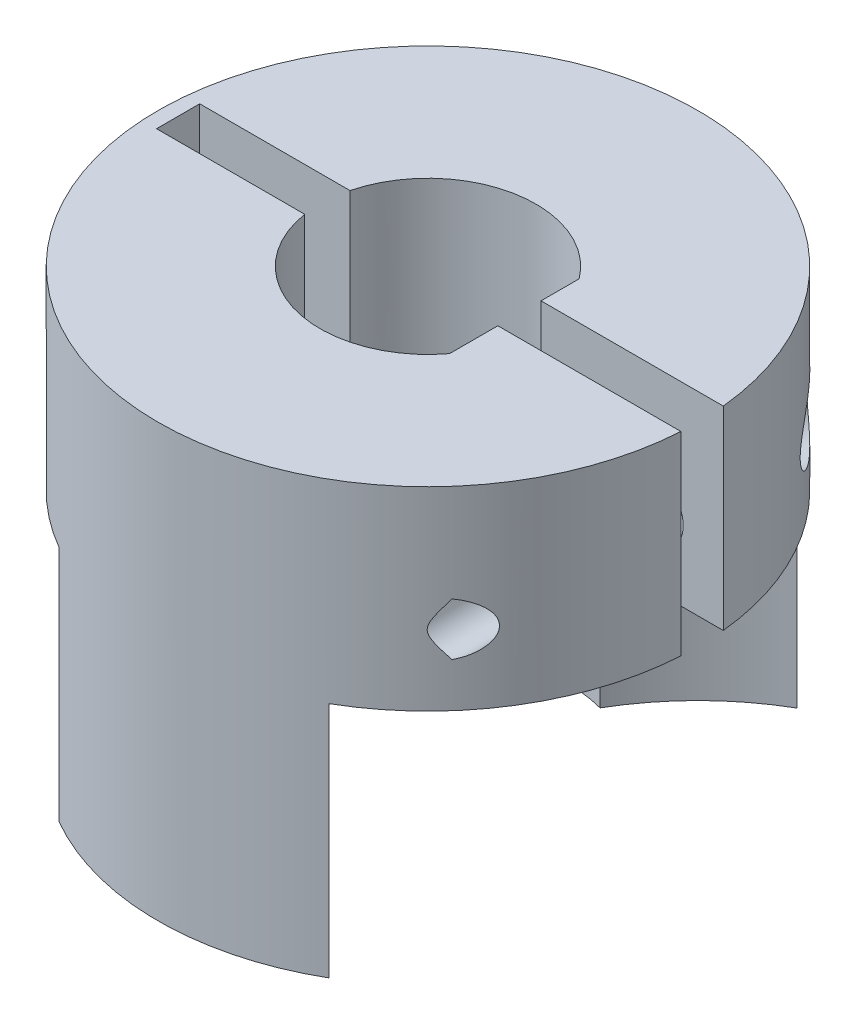
ISO-10303-21;
HEADER;
FILE_DESCRIPTION(('STEP AP214'),'2;1');
FILE_NAME('part.step','',(''),(''),'','','');
FILE_SCHEMA(('AUTOMOTIVE_DESIGN { 1 0 10303 214 1 1 1 1 }'));
ENDSEC;
DATA;
#1=APPLICATION_CONTEXT('core data for automotive mechanical design processes');
#2=APPLICATION_PROTOCOL_DEFINITION('international standard','automotive_design',2000,#1);
#3=PRODUCT_CONTEXT('',#1,'mechanical');
#4=PRODUCT('Part','Part','',(#3));
#5=PRODUCT_RELATED_PRODUCT_CATEGORY('part','',(#4));
#6=PRODUCT_DEFINITION_FORMATION('','',#4);
#7=PRODUCT_DEFINITION_CONTEXT('part definition',#1,'design');
#8=PRODUCT_DEFINITION('design','',#6,#7);
#9=PRODUCT_DEFINITION_SHAPE('','',#8);
#10=(LENGTH_UNIT() NAMED_UNIT(*) SI_UNIT(.MILLI.,.METRE.));
#11=(NAMED_UNIT(*) PLANE_ANGLE_UNIT() SI_UNIT($,.RADIAN.));
#12=(NAMED_UNIT(*) SI_UNIT($,.STERADIAN.) SOLID_ANGLE_UNIT());
#13=UNCERTAINTY_MEASURE_WITH_UNIT(LENGTH_MEASURE(1.E-05),#10,'distance_accuracy_value','');
#14=(GEOMETRIC_REPRESENTATION_CONTEXT(3) GLOBAL_UNCERTAINTY_ASSIGNED_CONTEXT((#13)) GLOBAL_UNIT_ASSIGNED_CONTEXT((#10,
#11,#12)) REPRESENTATION_CONTEXT('',''));
#15=CARTESIAN_POINT('',(0.,0.,0.));
#16=DIRECTION('',(0.,0.,1.));
#17=DIRECTION('',(1.,0.,0.));
#18=AXIS2_PLACEMENT_3D('',#15,#16,#17);
#19=CARTESIAN_POINT('',(9.0873866256993,3.27091239165496,8.26580270830846));
#20=DIRECTION('',(0.,0.,-1.));
#21=DIRECTION('',(-1.,0.,0.));
#22=AXIS2_PLACEMENT_3D('',#19,#20,#21);
#23=CONICAL_SURFACE('',#22,1.25000000001818,1.02974425869486);
#24=CARTESIAN_POINT('',(9.37691343605857,2.05490489736888,8.26580270827864));
#25=CARTESIAN_POINT('',(9.34823636964544,2.10377913839185,8.29833765727385));
#26=CARTESIAN_POINT('',(9.31937379006483,2.15263708601481,8.33073567660937));
#27=CARTESIAN_POINT('',(9.26145900650451,2.25060359496529,8.3950723029447));
#28=CARTESIAN_POINT('',(9.23240668328306,2.29971230857222,8.42701057028863));
#29=CARTESIAN_POINT('',(9.17398462157774,2.39899043619154,8.49057671104065));
#30=CARTESIAN_POINT('',(9.14461528034057,2.44916549976722,8.52219619644441));
#31=CARTESIAN_POINT('',(9.08634435046157,2.55045645984429,8.58429704274558));
#32=CARTESIAN_POINT('',(9.05744259648956,2.60157200951201,8.61477881113187));
#33=CARTESIAN_POINT('',(9.00354761064104,2.70073710212104,8.67107231345171));
#34=CARTESIAN_POINT('',(8.9784419807633,2.74862479685397,8.69705395236432));
#35=CARTESIAN_POINT('',(8.94256452914462,2.82239890995484,8.7338901458976));
#36=CARTESIAN_POINT('',(8.93090353018432,2.84731087232748,8.74581150341275));
#37=CARTESIAN_POINT('',(8.90848505946333,2.89798263721264,8.76864580340958));
#38=CARTESIAN_POINT('',(8.89772721596009,2.92374208475953,8.77955916097537));
#39=CARTESIAN_POINT('',(8.87477187867222,2.98351899911913,8.8027697516426));
#40=CARTESIAN_POINT('',(8.86298277476017,3.01787154664654,8.81463178938376));
#41=CARTESIAN_POINT('',(8.84297662071251,3.0885904327126,8.83470252808923));
#42=CARTESIAN_POINT('',(8.83474366884786,3.12494696915738,8.8429274966196));
#43=CARTESIAN_POINT('',(8.82646544984643,3.17997429994769,8.85118760745881));
#44=CARTESIAN_POINT('',(8.82438832670974,3.19803567567978,8.85325786514942));
#45=CARTESIAN_POINT('',(8.82159655147002,3.23436609213067,8.8560396277983));
#46=CARTESIAN_POINT('',(8.82088162370194,3.25263509008038,8.85675140766933));
#47=CARTESIAN_POINT('',(8.82089059499563,3.30119070653191,8.85674275516931));
#48=CARTESIAN_POINT('',(8.82286746779234,3.33149180944732,8.85477504941482));
#49=CARTESIAN_POINT('',(8.83036615861769,3.39121750209244,8.84729665177245));
#50=CARTESIAN_POINT('',(8.83589671842577,3.42063974260183,8.841777222887));
#51=CARTESIAN_POINT('',(8.84997684207437,3.47974627246575,8.8276844707538));
#52=CARTESIAN_POINT('',(8.85867557033292,3.50935615822802,8.81896003270859));
#53=CARTESIAN_POINT('',(8.87806287003813,3.56723388829251,8.79944254836492));
#54=CARTESIAN_POINT('',(8.88875511147401,3.59549913471964,8.78864568570435));
#55=CARTESIAN_POINT('',(8.91158572947415,3.65127080230195,8.7654953073146));
#56=CARTESIAN_POINT('',(8.92374162950388,3.67876189455889,8.75312279991039));
#57=CARTESIAN_POINT('',(8.94890827634455,3.73283433069144,8.72739164745311));
#58=CARTESIAN_POINT('',(8.96191833341778,3.75941638287051,8.71403379702007));
#59=CARTESIAN_POINT('',(8.99137826196812,3.81760440217316,8.68364300764587));
#60=CARTESIAN_POINT('',(9.00796311503814,3.8490523004461,8.66644045492225));
#61=CARTESIAN_POINT('',(9.04162787703195,3.91127509182417,8.63131272356054));
#62=CARTESIAN_POINT('',(9.05870787571594,3.94204986110761,8.61338741366761));
#63=CARTESIAN_POINT('',(9.11038941308483,4.03374716493374,8.55881467340505));
#64=CARTESIAN_POINT('',(9.14540001417478,4.09398140351941,8.52140386924328));
#65=CARTESIAN_POINT('',(9.21333518724035,4.20983556081705,8.44788756437903));
#66=CARTESIAN_POINT('',(9.24625068273812,4.2655051359255,8.41185056329275));
#67=CARTESIAN_POINT('',(9.31183061237871,4.37641137251642,8.33919771970762));
#68=CARTESIAN_POINT('',(9.34449542356095,4.43164868873858,8.30258321961203));
#69=CARTESIAN_POINT('',(9.37691343606799,4.48691988594578,8.26580270829685));
#70=B_SPLINE_CURVE_WITH_KNOTS('',3,(#24,#25,#26,#27,#28,#29,#30,#31,#32,#33,#34,#35,#36,#37,#38,
#39,#40,#41,#42,#43,#44,#45,#46,#47,#48,#49,#50,#51,#52,#53,#54,#55,#56,#57,#58,#59,#60,#61,#62,
#63,#64,#65,#66,#67,#68,#69),.UNSPECIFIED.,.F.,.F.,(4,2,2,2,2,2,2,2,2,2,2,2,2,2,2,2,2,2,2,2,2,2,
4),(0.,0.19602753707263,0.392193144534779,0.59072440701087,0.78918386679318,0.969036882124861,
1.05894136689586,1.14880866330088,1.26320249647365,1.37707937178137,1.43188093236441,
1.48667140167539,1.5774377040964,1.66842814345155,1.764417363518,1.8605850732717,
1.95804683652526,2.05543084435016,2.1738952739997,2.29238131489985,2.52958422441266,
2.75168786867404,2.97333487639234),.UNSPECIFIED.);
#71=CARTESIAN_POINT('',(9.37691343608817,2.05490489738761,8.26580270827397));
#72=VERTEX_POINT('',#71);
#73=CARTESIAN_POINT('',(9.37691343608786,4.48691988592178,8.26580270827431));
#74=VERTEX_POINT('',#73);
#75=EDGE_CURVE('E21',#72,#74,#70,.T.);
#76=ORIENTED_EDGE('',*,*,#75,.F.);
#77=CARTESIAN_POINT('',(9.0873866256993,3.27091239165496,8.26580270825177));
#78=DIRECTION('',(0.,0.,-1.));
#79=DIRECTION('',(-1.,0.,0.));
#80=AXIS2_PLACEMENT_3D('',#77,#78,#79);
#81=CIRCLE('',#80,1.25);
#82=EDGE_CURVE('E142',#72,#74,#81,.T.);
#83=ORIENTED_EDGE('',*,*,#82,.T.);
#84=EDGE_LOOP('',(#76,#83));
#85=FACE_BOUND('',#84,.T.);
#86=ADVANCED_FACE('F17',(#85),#23,.F.);
#87=CARTESIAN_POINT('',(0.,0.999999999999999,0.));
#88=DIRECTION('',(0.,1.,0.));
#89=DIRECTION('',(0.,0.,1.));
#90=AXIS2_PLACEMENT_3D('',#87,#88,#89);
#91=PLANE('',#90);
#92=DIRECTION('',(1.,0.,0.));
#93=VECTOR('',#92,1.);
#94=CARTESIAN_POINT('',(-11.8043105196322,0.999999999999999,0.765802708251773));
#95=LINE('',#94,#93);
#96=CARTESIAN_POINT('',(-11.8043105196322,0.999999999999999,0.765802708251773));
#97=VERTEX_POINT('',#96);
#98=CARTESIAN_POINT('',(-4.94100659906807,0.999999999999999,0.765802708251773));
#99=VERTEX_POINT('',#98);
#100=EDGE_CURVE('E144',#97,#99,#95,.T.);
#101=ORIENTED_EDGE('',*,*,#100,.T.);
#102=CARTESIAN_POINT('',(0.,0.999999999999999,0.));
#103=DIRECTION('',(0.,-1.,0.));
#104=DIRECTION('',(0.,0.,-1.));
#105=AXIS2_PLACEMENT_3D('',#102,#103,#104);
#106=CIRCLE('',#105,5.);
#107=CARTESIAN_POINT('',(-4.84528193658959,0.999999999999999,-1.23419729174823));
#108=VERTEX_POINT('',#107);
#109=EDGE_CURVE('E337',#99,#108,#106,.T.);
#110=ORIENTED_EDGE('',*,*,#109,.T.);
#111=DIRECTION('',(-1.,0.,0.));
#112=VECTOR('',#111,1.);
#113=CARTESIAN_POINT('',(-3.32475969081981,0.999999999999999,-1.23419729174823));
#114=LINE('',#113,#112);
#115=CARTESIAN_POINT('',(-11.8043105196322,0.999999999999999,-1.23419729174823));
#116=VERTEX_POINT('',#115);
#117=EDGE_CURVE('E229',#108,#116,#114,.T.);
#118=ORIENTED_EDGE('',*,*,#117,.T.);
#119=DIRECTION('',(0.,0.,1.));
#120=VECTOR('',#119,1.);
#121=CARTESIAN_POINT('',(-11.8043105196322,0.999999999999999,-1.23419729174823));
#122=LINE('',#121,#120);
#123=EDGE_CURVE('E221',#116,#97,#122,.T.);
#124=ORIENTED_EDGE('',*,*,#123,.T.);
#125=EDGE_LOOP('',(#101,#110,#118,#124));
#126=FACE_BOUND('',#125,.T.);
#127=ADVANCED_FACE('F208',(#126),#91,.T.);
#128=CARTESIAN_POINT('',(9.0873866256993,3.27091239165496,0.765802708251773));
#129=DIRECTION('',(0.,0.,-1.));
#130=DIRECTION('',(-1.,0.,0.));
#131=AXIS2_PLACEMENT_3D('',#128,#129,#130);
#132=CYLINDRICAL_SURFACE('',#131,1.25);
#133=CARTESIAN_POINT('',(9.0873866256993,3.27091239165496,0.765802708251773));
#134=DIRECTION('',(0.,0.,-1.));
#135=DIRECTION('',(-1.,0.,0.));
#136=AXIS2_PLACEMENT_3D('',#133,#134,#135);
#137=CIRCLE('',#136,1.25);
#138=CARTESIAN_POINT('',(7.8373866256993,3.27091239165496,0.765802708251773));
#139=VERTEX_POINT('',#138);
#140=EDGE_CURVE('E329',#139,#139,#137,.T.);
#141=ORIENTED_EDGE('',*,*,#140,.T.);
#142=EDGE_LOOP('',(#141));
#143=FACE_BOUND('',#142,.T.);
#144=CARTESIAN_POINT('',(9.37691343610224,4.48691988589909,8.265802708258));
#145=CARTESIAN_POINT('',(9.42635211766137,4.47512071704447,8.20972797600935));
#146=CARTESIAN_POINT('',(9.47497923156122,4.46038262060935,8.1535407076429));
#147=CARTESIAN_POINT('',(9.57042977419815,4.42494242517149,8.04128549213383));
#148=CARTESIAN_POINT('',(9.61724884594837,4.40422682872897,7.98521810760817));
#149=CARTESIAN_POINT('',(9.70919960881088,4.35652663614726,7.87316740356659));
#150=CARTESIAN_POINT('',(9.7543057733657,4.32947283321155,7.81719243087551));
#151=CARTESIAN_POINT('',(9.84183287731895,4.26898035623884,7.70670366523164));
#152=CARTESIAN_POINT('',(9.88425681548962,4.23554898671687,7.65218828122307));
#153=CARTESIAN_POINT('',(9.9670636216485,4.16078164336086,7.54403098772386));
#154=CARTESIAN_POINT('',(10.0073602963814,4.11925639531322,7.49045254240309));
#155=CARTESIAN_POINT('',(10.083684943877,4.02815291750281,7.38738000353898));
#156=CARTESIAN_POINT('',(10.1197235480285,3.97859550959755,7.33787583557525));
#157=CARTESIAN_POINT('',(10.1784621073682,3.88282606204299,7.25608955181111));
#158=CARTESIAN_POINT('',(10.2023205996824,3.83848351710648,7.22247011074012));
#159=CARTESIAN_POINT('',(10.2455821366241,3.74395761270726,7.16096736805215));
#160=CARTESIAN_POINT('',(10.2649922832987,3.69378375907839,7.13307493045183));
#161=CARTESIAN_POINT('',(10.2932897849698,3.60244101476354,7.09215256357241));
#162=CARTESIAN_POINT('',(10.3036028579756,3.56260733902115,7.07714527479881));
#163=CARTESIAN_POINT('',(10.3203901095135,3.48053854465573,7.05264290959657));
#164=CARTESIAN_POINT('',(10.3268741502231,3.43830990514017,7.04313367354294));
#165=CARTESIAN_POINT('',(10.333227157052,3.37488587308372,7.03380609880895));
#166=CARTESIAN_POINT('',(10.3347825481541,3.35419382855318,7.03151999048695));
#167=CARTESIAN_POINT('',(10.3368631741153,3.31264241161596,7.02846091769711));
#168=CARTESIAN_POINT('',(10.3373881959266,3.29178300549926,7.0276882661644));
#169=CARTESIAN_POINT('',(10.3373834612683,3.22885248262355,7.02769585710759));
#170=CARTESIAN_POINT('',(10.3352416429691,3.18674705552835,7.03084913282139));
#171=CARTESIAN_POINT('',(10.3268727273246,3.10381253987385,7.04313501285828));
#172=CARTESIAN_POINT('',(10.320637743538,3.06298607495619,7.05227915992845));
#173=CARTESIAN_POINT('',(10.3027386674938,2.97442886047198,7.07840924045334));
#174=CARTESIAN_POINT('',(10.2901537464402,2.92727899631073,7.09671784790626));
#175=CARTESIAN_POINT('',(10.2606964174355,2.83720510109077,7.13924216690707));
#176=CARTESIAN_POINT('',(10.2438168989196,2.79428824376109,7.16346767237377));
#177=CARTESIAN_POINT('',(10.1972048894908,2.69176515500364,7.22975599655687));
#178=CARTESIAN_POINT('',(10.1653291973777,2.63494171793569,7.27458106309522));
#179=CARTESIAN_POINT('',(10.0962539806625,2.53021157642081,7.37015339172015));
#180=CARTESIAN_POINT('',(10.0590401505951,2.48232965422342,7.42091649721168));
#181=CARTESIAN_POINT('',(9.98818383602695,2.40297464708103,7.51591604457926));
#182=CARTESIAN_POINT('',(9.95523140298635,2.37011690945146,7.55952955719941));
#183=CARTESIAN_POINT('',(9.88714518603896,2.30915610007333,7.6483661327337));
#184=CARTESIAN_POINT('',(9.8520099738852,2.28105618724709,7.6935902410651));
#185=CARTESIAN_POINT('',(9.74380555650733,2.20343499031652,7.83082057760833));
#186=CARTESIAN_POINT('',(9.66789616186177,2.16054769618412,7.92444073776088));
#187=CARTESIAN_POINT('',(9.55475796989306,2.11096847021031,8.05974659889356));
#188=CARTESIAN_POINT('',(9.51979073508178,2.09748676243211,8.10102206760082));
#189=CARTESIAN_POINT('',(9.44900316802141,2.07378297086981,8.18347540666459));
#190=CARTESIAN_POINT('',(9.4131868374943,2.0635479813073,8.22465300085292));
#191=CARTESIAN_POINT('',(9.3769134361023,2.05490489741057,8.26580270825795));
#192=B_SPLINE_CURVE_WITH_KNOTS('',3,(#144,#145,#146,#147,#148,#149,#150,#151,#152,#153,#154,
#155,#156,#157,#158,#159,#160,#161,#162,#163,#164,#165,#166,#167,#168,#169,#170,#171,#172,#173,
#174,#175,#176,#177,#178,#179,#180,#181,#182,#183,#184,#185,#186,#187,#188,#189,#190,#191),
.UNSPECIFIED.,.F.,.F.,(4,2,2,2,2,2,2,2,2,2,2,2,2,2,2,2,2,2,2,2,2,2,2,4),(0.,0.227001607773341,
0.454519860268775,0.684648796905926,0.914515722016699,1.15059739845029,1.38607658854649,
1.56718608661381,1.74800438636254,1.87893095048438,2.0095188083324,2.07207559165955,
2.13464530839128,2.26074014266351,2.38707864401641,2.54257209338251,2.69832468792664,
2.93426268186902,3.17084519744942,3.36191791656559,3.55311700371936,3.93526999589727,
4.10245218293676,4.26896123863168),.UNSPECIFIED.);
#193=EDGE_CURVE('E141',#74,#72,#192,.T.);
#194=ORIENTED_EDGE('',*,*,#193,.F.);
#195=ORIENTED_EDGE('',*,*,#82,.F.);
#196=EDGE_LOOP('',(#194,#195));
#197=FACE_BOUND('',#196,.T.);
#198=ADVANCED_FACE('F146',(#143,#197),#132,.F.);
#199=CARTESIAN_POINT('',(-11.8043105196322,0.999999999999999,0.765802708251773));
#200=DIRECTION('',(0.,0.,1.));
#201=DIRECTION('',(1.,0.,0.));
#202=AXIS2_PLACEMENT_3D('',#199,#200,#201);
#203=PLANE('',#202);
#204=ORIENTED_EDGE('',*,*,#100,.F.);
#205=DIRECTION('',(0.,1.,0.));
#206=VECTOR('',#205,1.);
#207=CARTESIAN_POINT('',(-11.8043105196322,0.999999999999999,0.765802708251773));
#208=LINE('',#207,#206);
#209=CARTESIAN_POINT('',(-11.8043105196322,9.,0.765802708251773));
#210=VERTEX_POINT('',#209);
#211=EDGE_CURVE('E214',#97,#210,#208,.T.);
#212=ORIENTED_EDGE('',*,*,#211,.T.);
#213=DIRECTION('',(1.,0.,0.));
#214=VECTOR('',#213,1.);
#215=CARTESIAN_POINT('',(0.,9.,0.765802708251773));
#216=LINE('',#215,#214);
#217=CARTESIAN_POINT('',(-4.94100659906807,9.,0.765802708251773));
#218=VERTEX_POINT('',#217);
#219=EDGE_CURVE('E334',#218,#210,#216,.F.);
#220=ORIENTED_EDGE('',*,*,#219,.F.);
#221=DIRECTION('',(0.,-1.,0.));
#222=VECTOR('',#221,1.);
#223=CARTESIAN_POINT('',(-4.94100659906807,9.,0.765802708251773));
#224=LINE('',#223,#222);
#225=EDGE_CURVE('E217',#218,#99,#224,.T.);
#226=ORIENTED_EDGE('',*,*,#225,.T.);
#227=EDGE_LOOP('',(#204,#212,#220,#226));
#228=FACE_BOUND('',#227,.T.);
#229=ADVANCED_FACE('F200',(#228),#203,.F.);
#230=CARTESIAN_POINT('',(-11.8043105196322,0.999999999999999,-1.23419729174823));
#231=DIRECTION('',(-1.,0.,0.));
#232=DIRECTION('',(0.,0.,1.));
#233=AXIS2_PLACEMENT_3D('',#230,#231,#232);
#234=PLANE('',#233);
#235=ORIENTED_EDGE('',*,*,#211,.F.);
#236=ORIENTED_EDGE('',*,*,#123,.F.);
#237=DIRECTION('',(0.,1.,0.));
#238=VECTOR('',#237,1.);
#239=CARTESIAN_POINT('',(-11.8043105196322,0.999999999999999,-1.23419729174823));
#240=LINE('',#239,#238);
#241=CARTESIAN_POINT('',(-11.8043105196322,9.,-1.23419729174823));
#242=VERTEX_POINT('',#241);
#243=EDGE_CURVE('E232',#116,#242,#240,.T.);
#244=ORIENTED_EDGE('',*,*,#243,.T.);
#245=DIRECTION('',(0.,0.,1.));
#246=VECTOR('',#245,1.);
#247=CARTESIAN_POINT('',(-11.8043105196322,9.,0.));
#248=LINE('',#247,#246);
#249=EDGE_CURVE('E227',#210,#242,#248,.F.);
#250=ORIENTED_EDGE('',*,*,#249,.F.);
#251=EDGE_LOOP('',(#235,#236,#244,#250));
#252=FACE_BOUND('',#251,.T.);
#253=ADVANCED_FACE('F197',(#252),#234,.F.);
#254=CARTESIAN_POINT('',(-3.32475969081981,0.999999999999999,-1.23419729174823));
#255=DIRECTION('',(0.,0.,-1.));
#256=DIRECTION('',(-1.,0.,0.));
#257=AXIS2_PLACEMENT_3D('',#254,#255,#256);
#258=PLANE('',#257);
#259=DIRECTION('',(1.,0.,0.));
#260=VECTOR('',#259,1.);
#261=CARTESIAN_POINT('',(0.,9.,-1.23419729174823));
#262=LINE('',#261,#260);
#263=CARTESIAN_POINT('',(-4.84528193658959,9.,-1.23419729174823));
#264=VERTEX_POINT('',#263);
#265=EDGE_CURVE('E342',#242,#264,#262,.T.);
#266=ORIENTED_EDGE('',*,*,#265,.F.);
#267=ORIENTED_EDGE('',*,*,#243,.F.);
#268=ORIENTED_EDGE('',*,*,#117,.F.);
#269=DIRECTION('',(0.,-1.,0.));
#270=VECTOR('',#269,1.);
#271=CARTESIAN_POINT('',(-4.84528193658959,9.,-1.23419729174823));
#272=LINE('',#271,#270);
#273=EDGE_CURVE('E322',#108,#264,#272,.F.);
#274=ORIENTED_EDGE('',*,*,#273,.T.);
#275=EDGE_LOOP('',(#266,#267,#268,#274));
#276=FACE_BOUND('',#275,.T.);
#277=ADVANCED_FACE('F192',(#276),#258,.F.);
#278=CARTESIAN_POINT('',(9.08341624904097,3.2825117784796,-11.));
#279=DIRECTION('',(0.,0.,1.));
#280=DIRECTION('',(1.,0.,0.));
#281=AXIS2_PLACEMENT_3D('',#278,#279,#280);
#282=CYLINDRICAL_SURFACE('',#281,1.5);
#283=CARTESIAN_POINT('',(9.08341624904097,3.2825117784796,-1.23419729174823));
#284=DIRECTION('',(0.,0.,1.));
#285=DIRECTION('',(1.,0.,0.));
#286=AXIS2_PLACEMENT_3D('',#283,#284,#285);
#287=CIRCLE('',#286,1.5);
#288=CARTESIAN_POINT('',(10.583416249041,3.2825117784796,-1.23419729174823));
#289=VERTEX_POINT('',#288);
#290=EDGE_CURVE('E316',#289,#289,#287,.T.);
#291=ORIENTED_EDGE('',*,*,#290,.T.);
#292=EDGE_LOOP('',(#291));
#293=FACE_BOUND('',#292,.T.);
#294=CARTESIAN_POINT('',(7.58341624904096,3.2825117784796,-9.936890760886));
#295=CARTESIAN_POINT('',(7.5834209983723,3.21143745133633,-9.93688791578893));
#296=CARTESIAN_POINT('',(7.58850330023537,3.14029955579842,-9.933014902131));
#297=CARTESIAN_POINT('',(7.60851615660126,3.00021188265577,-9.91769288383972));
#298=CARTESIAN_POINT('',(7.62346062306707,2.9312653404797,-9.90623317704108));
#299=CARTESIAN_POINT('',(7.66218339506182,2.79784373522121,-9.87631183146526));
#300=CARTESIAN_POINT('',(7.68592572763091,2.73335171505184,-9.85787869948852));
#301=CARTESIAN_POINT('',(7.74093401058121,2.60997250290294,-9.81474183306818));
#302=CARTESIAN_POINT('',(7.77219977970482,2.55108517594063,-9.79003824969398));
#303=CARTESIAN_POINT('',(7.84283812936195,2.43648492336443,-9.73355252599749));
#304=CARTESIAN_POINT('',(7.88258117882353,2.3811665799132,-9.70143779820937));
#305=CARTESIAN_POINT('',(7.96720279283359,2.27826359565636,-9.63206545559696));
#306=CARTESIAN_POINT('',(8.01208410240839,2.23068312183544,-9.59480508959177));
#307=CARTESIAN_POINT('',(8.12803827065346,2.12223910452323,-9.497006711656));
#308=CARTESIAN_POINT('',(8.20131124737801,2.06602186903032,-9.43390328109512));
#309=CARTESIAN_POINT('',(8.35207102013524,1.96981634606421,-9.30070468959651));
#310=CARTESIAN_POINT('',(8.42956687483015,1.92986463990707,-9.23059420563224));
#311=CARTESIAN_POINT('',(8.61254699709539,1.85382196597489,-9.06059550866597));
#312=CARTESIAN_POINT('',(8.71859898789944,1.82364926863922,-8.95868026574796));
#313=CARTESIAN_POINT('',(8.92889036520317,1.78666910321221,-8.74911800772141));
#314=CARTESIAN_POINT('',(9.03312830513469,1.77987950182748,-8.64146667348855));
#315=CARTESIAN_POINT('',(9.23976660787357,1.7870184874968,-8.42022507384299));
#316=CARTESIAN_POINT('',(9.34205954980291,1.80145823446578,-8.30655393851707));
#317=CARTESIAN_POINT('',(9.54047540872224,1.85018755505512,-8.0778860434292));
#318=CARTESIAN_POINT('',(9.63659273291734,1.88449484739089,-7.96288819028606));
#319=CARTESIAN_POINT('',(9.77570791829862,1.95081291897803,-7.79045215428129));
#320=CARTESIAN_POINT('',(9.82159559527422,1.97566541170884,-7.73250250591096));
#321=CARTESIAN_POINT('',(9.91117603914184,2.03048444366458,-7.6173419113347));
#322=CARTESIAN_POINT('',(9.95486961946798,2.06044906923913,-7.56013069729581));
#323=CARTESIAN_POINT('',(10.0397434101869,2.12566332208265,-7.44704924449809));
#324=CARTESIAN_POINT('',(10.0809279785422,2.16090339541066,-7.39117678917208));
#325=CARTESIAN_POINT('',(10.160499810509,2.23708200250361,-7.28140311598012));
#326=CARTESIAN_POINT('',(10.1988891090759,2.27801632637213,-7.22750047862018));
#327=CARTESIAN_POINT('',(10.2728464639377,2.36674099585688,-7.1219957907564));
#328=CARTESIAN_POINT('',(10.3083735914831,2.41461012802127,-7.07043059667324));
#329=CARTESIAN_POINT('',(10.3752137042791,2.51764115621368,-6.97197719565034));
#330=CARTESIAN_POINT('',(10.4065295982458,2.57279796586568,-6.92508576637646));
#331=CARTESIAN_POINT('',(10.4579800922965,2.67970784988213,-6.84707214862437));
#332=CARTESIAN_POINT('',(10.4791041463771,2.73002536512659,-6.81465827642767));
#333=CARTESIAN_POINT('',(10.5165693905218,2.83616966135234,-6.75669732141226));
#334=CARTESIAN_POINT('',(10.532917861344,2.89198788045397,-6.73113979046078));
#335=CARTESIAN_POINT('',(10.5562086130654,2.99450683549837,-6.69453623048669));
#336=CARTESIAN_POINT('',(10.5644664017396,3.04018409691659,-6.68147999515021));
#337=CARTESIAN_POINT('',(10.5767232244352,3.13343201951037,-6.66206155675668));
#338=CARTESIAN_POINT('',(10.5807356205517,3.18099624822828,-6.65567835153824));
#339=CARTESIAN_POINT('',(10.583096672453,3.24666744110013,-6.65192171301857));
#340=CARTESIAN_POINT('',(10.5834182766484,3.26458434394094,-6.65140989160156));
#341=CARTESIAN_POINT('',(10.5834108043814,3.33065165875324,-6.65142289904988));
#342=CARTESIAN_POINT('',(10.5810717677964,3.37886747929252,-6.6551483866685));
#343=CARTESIAN_POINT('',(10.5719341781345,3.47385077021342,-6.66965327841151));
#344=CARTESIAN_POINT('',(10.5651225933671,3.52061358868959,-6.68045329541552));
#345=CARTESIAN_POINT('',(10.5454716120921,3.62267840069705,-6.711440749881));
#346=CARTESIAN_POINT('',(10.5315646893849,3.67726780843524,-6.73327919141995));
#347=CARTESIAN_POINT('',(10.4990305068669,3.78154725415173,-6.78389749969401));
#348=CARTESIAN_POINT('',(10.4803958062068,3.83122939593955,-6.81268830498432));
#349=CARTESIAN_POINT('',(10.427968305902,3.95234013069076,-6.89281158413716));
#350=CARTESIAN_POINT('',(10.3915512295978,4.02024603153238,-6.94770395071204));
#351=CARTESIAN_POINT('',(10.3125010145991,4.14556359017478,-7.0645128933592));
#352=CARTESIAN_POINT('',(10.2698511200115,4.20294598883921,-7.12644830062381));
#353=CARTESIAN_POINT('',(10.1872258702898,4.29983786888201,-7.24394352711663));
#354=CARTESIAN_POINT('',(10.147962656107,4.34073483979892,-7.29887862566727));
#355=CARTESIAN_POINT('',(10.0666082669755,4.41672283226147,-7.41068025291333));
#356=CARTESIAN_POINT('',(10.0245152982286,4.45181012127855,-7.46754799521294));
#357=CARTESIAN_POINT('',(9.93783796932352,4.51656633648426,-7.58251685589977));
#358=CARTESIAN_POINT('',(9.89325194210634,4.54623157907935,-7.6406187830662));
#359=CARTESIAN_POINT('',(9.80185872325339,4.60033528419106,-7.75751798378818));
#360=CARTESIAN_POINT('',(9.75505065783489,4.62477166938419,-7.8163155239441));
#361=CARTESIAN_POINT('',(9.60678033894445,4.69258755496035,-7.99906903391212));
#362=CARTESIAN_POINT('',(9.50183172474101,4.72723970766937,-8.12356024818867));
#363=CARTESIAN_POINT('',(9.28493656782968,4.77303164926719,-8.37060044994946));
#364=CARTESIAN_POINT('',(9.17299600335341,4.78419124882396,-8.49315098732272));
#365=CARTESIAN_POINT('',(8.96070282622876,4.78069355404172,-8.71642523312947));
#366=CARTESIAN_POINT('',(8.86096454891668,4.76948021029307,-8.81777553595151));
#367=CARTESIAN_POINT('',(8.66051704383935,4.72530822948064,-9.01471400014966));
#368=CARTESIAN_POINT('',(8.55980916272754,4.69237638276791,-9.1103091023809));
#369=CARTESIAN_POINT('',(8.38642041004746,4.61324573878577,-9.26974555640308));
#370=CARTESIAN_POINT('',(8.3130594453231,4.57246487844142,-9.33552730945021));
#371=CARTESIAN_POINT('',(8.17062868114745,4.47590824915122,-9.460430391562));
#372=CARTESIAN_POINT('',(8.10155267174113,4.42015483517101,-9.51956146526428));
#373=CARTESIAN_POINT('',(7.98436369888639,4.30591644918387,-9.6179299005839));
#374=CARTESIAN_POINT('',(7.93483830470483,4.25027099312548,-9.65877097335902));
#375=CARTESIAN_POINT('',(7.84289079923566,4.12919048536879,-9.73357969225019));
#376=CARTESIAN_POINT('',(7.80046921861758,4.06375470300365,-9.76754682490819));
#377=CARTESIAN_POINT('',(7.72486934906234,3.9234187624508,-9.82744903653183));
#378=CARTESIAN_POINT('',(7.69178148408154,3.84843559440766,-9.85330579537247));
#379=CARTESIAN_POINT('',(7.63793806830967,3.69167275217619,-9.89510422431719));
#380=CARTESIAN_POINT('',(7.61714927054076,3.6099120883431,-9.91107263024293));
#381=CARTESIAN_POINT('',(7.59676717538482,3.48632662021488,-9.92669063420421));
#382=CARTESIAN_POINT('',(7.59177336815796,3.44582809263831,-9.930508250563));
#383=CARTESIAN_POINT('',(7.58509658081788,3.36439733028368,-9.93560909980598));
#384=CARTESIAN_POINT('',(7.58341351245611,3.32346510709512,-9.93689240024299));
#385=CARTESIAN_POINT('',(7.58341624904096,3.2825117784796,-9.936890760886));
#386=B_SPLINE_CURVE_WITH_KNOTS('',3,(#294,#295,#296,#297,#298,#299,#300,#301,#302,#303,#304,
#305,#306,#307,#308,#309,#310,#311,#312,#313,#314,#315,#316,#317,#318,#319,#320,#321,#322,#323,
#324,#325,#326,#327,#328,#329,#330,#331,#332,#333,#334,#335,#336,#337,#338,#339,#340,#341,#342,
#343,#344,#345,#346,#347,#348,#349,#350,#351,#352,#353,#354,#355,#356,#357,#358,#359,#360,#361,
#362,#363,#364,#365,#366,#367,#368,#369,#370,#371,#372,#373,#374,#375,#376,#377,#378,#379,#380,
#381,#382,#383,#384,#385),.UNSPECIFIED.,.T.,.F.,(4,2,2,2,2,2,2,2,2,2,2,2,2,2,2,2,2,2,2,2,2,2,2,
2,2,2,2,2,2,2,2,2,2,2,2,2,2,2,2,2,2,2,2,2,2,4),(0.,0.2130544743075,0.426410136043908,
0.638902879937481,0.851390504884473,1.07646323317594,1.30165676875022,1.635356685488,
1.96980300468222,2.41782305252272,2.86618535055018,3.32552163760485,3.78526821241258,
4.0190591047744,4.25276267227333,4.48604800667702,4.71916177532404,4.95516878664214,
5.19101194038896,5.38084029179763,5.57037770590489,5.71446325485677,5.85809394254616,
5.91185465621843,6.05621632235796,6.20100049369756,6.38123406762707,6.56175308253496,
6.84400054552353,7.12702123928809,7.36353525376719,7.60020063598683,7.8370262095117,
8.07394569526736,8.57145448698937,9.06854357396416,9.49498073424352,9.9208928543554,
10.2397125566259,10.5580588623553,10.8119383179371,11.0658367303861,11.3221164429486,
11.5777001738261,11.7004663375608,11.8232292288891),.UNSPECIFIED.);
#387=CARTESIAN_POINT('',(7.58341624904096,3.2825117784796,-9.936890760886));
#388=VERTEX_POINT('',#387);
#389=EDGE_CURVE('E176',#388,#388,#386,.T.);
#390=ORIENTED_EDGE('',*,*,#389,.F.);
#391=EDGE_LOOP('',(#390));
#392=FACE_BOUND('',#391,.T.);
#393=ADVANCED_FACE('F186',(#293,#392),#282,.F.);
#394=CARTESIAN_POINT('',(1.40924459198867,0.,0.765802708251773));
#395=DIRECTION('',(0.,0.,1.));
#396=DIRECTION('',(1.,0.,0.));
#397=AXIS2_PLACEMENT_3D('',#394,#395,#396);
#398=PLANE('',#397);
#399=DIRECTION('',(0.,1.,0.));
#400=VECTOR('',#399,1.);
#401=CARTESIAN_POINT('',(4.,9.,0.765802708251773));
#402=LINE('',#401,#400);
#403=CARTESIAN_POINT('',(4.,9.,0.765802708251773));
#404=VERTEX_POINT('',#403);
#405=CARTESIAN_POINT('',(4.,0.,0.765802708251773));
#406=VERTEX_POINT('',#405);
#407=EDGE_CURVE('E326',#404,#406,#402,.F.);
#408=ORIENTED_EDGE('',*,*,#407,.F.);
#409=DIRECTION('',(1.,0.,0.));
#410=VECTOR('',#409,1.);
#411=CARTESIAN_POINT('',(0.,9.,0.765802708251773));
#412=LINE('',#411,#410);
#413=CARTESIAN_POINT('',(12.4765197956816,9.,0.765802708251773));
#414=VERTEX_POINT('',#413);
#415=EDGE_CURVE('E383',#414,#404,#412,.F.);
#416=ORIENTED_EDGE('',*,*,#415,.F.);
#417=DIRECTION('',(0.,-1.,0.));
#418=VECTOR('',#417,1.);
#419=CARTESIAN_POINT('',(12.4765197956816,9.,0.765802708251774));
#420=LINE('',#419,#418);
#421=CARTESIAN_POINT('',(12.4765197956816,0.,0.765802708251773));
#422=VERTEX_POINT('',#421);
#423=EDGE_CURVE('E151',#422,#414,#420,.F.);
#424=ORIENTED_EDGE('',*,*,#423,.F.);
#425=DIRECTION('',(1.,0.,0.));
#426=VECTOR('',#425,1.);
#427=CARTESIAN_POINT('',(0.,0.,0.765802708251773));
#428=LINE('',#427,#426);
#429=EDGE_CURVE('E281',#422,#406,#428,.F.);
#430=ORIENTED_EDGE('',*,*,#429,.T.);
#431=EDGE_LOOP('',(#408,#416,#424,#430));
#432=FACE_BOUND('',#431,.T.);
#433=ORIENTED_EDGE('',*,*,#140,.F.);
#434=EDGE_LOOP('',(#433));
#435=FACE_BOUND('',#434,.T.);
#436=ADVANCED_FACE('F191',(#432,#435),#398,.F.);
#437=CARTESIAN_POINT('',(4.,9.,0.));
#438=DIRECTION('',(-1.,0.,0.));
#439=DIRECTION('',(0.,0.,1.));
#440=AXIS2_PLACEMENT_3D('',#437,#438,#439);
#441=PLANE('',#440);
#442=DIRECTION('',(0.,-1.,0.));
#443=VECTOR('',#442,1.);
#444=CARTESIAN_POINT('',(4.,9.,3.));
#445=LINE('',#444,#443);
#446=CARTESIAN_POINT('',(4.,0.,3.));
#447=VERTEX_POINT('',#446);
#448=CARTESIAN_POINT('',(4.,9.,3.));
#449=VERTEX_POINT('',#448);
#450=EDGE_CURVE('E323',#447,#449,#445,.F.);
#451=ORIENTED_EDGE('',*,*,#450,.T.);
#452=DIRECTION('',(0.,0.,1.));
#453=VECTOR('',#452,1.);
#454=CARTESIAN_POINT('',(4.,9.,0.));
#455=LINE('',#454,#453);
#456=EDGE_CURVE('E380',#404,#449,#455,.T.);
#457=ORIENTED_EDGE('',*,*,#456,.F.);
#458=ORIENTED_EDGE('',*,*,#407,.T.);
#459=DIRECTION('',(0.,0.,1.));
#460=VECTOR('',#459,1.);
#461=CARTESIAN_POINT('',(4.,0.,0.));
#462=LINE('',#461,#460);
#463=EDGE_CURVE('E277',#406,#447,#462,.T.);
#464=ORIENTED_EDGE('',*,*,#463,.T.);
#465=EDGE_LOOP('',(#451,#457,#458,#464));
#466=FACE_BOUND('',#465,.T.);
#467=ADVANCED_FACE('F428',(#466),#441,.T.);
#468=CARTESIAN_POINT('',(0.,9.,0.));
#469=DIRECTION('',(0.,-1.,0.));
#470=DIRECTION('',(0.,0.,-1.));
#471=AXIS2_PLACEMENT_3D('',#468,#469,#470);
#472=CYLINDRICAL_SURFACE('',#471,5.);
#473=CARTESIAN_POINT('',(0.,9.,0.));
#474=DIRECTION('',(0.,-1.,0.));
#475=DIRECTION('',(0.,0.,-1.));
#476=AXIS2_PLACEMENT_3D('',#473,#474,#475);
#477=CIRCLE('',#476,5.);
#478=CARTESIAN_POINT('',(4.,9.,-3.));
#479=VERTEX_POINT('',#478);
#480=EDGE_CURVE('E162',#264,#479,#477,.T.);
#481=ORIENTED_EDGE('',*,*,#480,.F.);
#482=ORIENTED_EDGE('',*,*,#273,.F.);
#483=ORIENTED_EDGE('',*,*,#109,.F.);
#484=ORIENTED_EDGE('',*,*,#225,.F.);
#485=CARTESIAN_POINT('',(0.,9.,0.));
#486=DIRECTION('',(0.,-1.,0.));
#487=DIRECTION('',(0.,0.,-1.));
#488=AXIS2_PLACEMENT_3D('',#485,#486,#487);
#489=CIRCLE('',#488,5.);
#490=EDGE_CURVE('E185',#449,#218,#489,.T.);
#491=ORIENTED_EDGE('',*,*,#490,.F.);
#492=ORIENTED_EDGE('',*,*,#450,.F.);
#493=CARTESIAN_POINT('',(0.,0.,0.));
#494=DIRECTION('',(0.,-1.,0.));
#495=DIRECTION('',(0.,0.,-1.));
#496=AXIS2_PLACEMENT_3D('',#493,#494,#495);
#497=CIRCLE('',#496,5.);
#498=CARTESIAN_POINT('',(4.,0.,-3.));
#499=VERTEX_POINT('',#498);
#500=EDGE_CURVE('E274',#447,#499,#497,.T.);
#501=ORIENTED_EDGE('',*,*,#500,.T.);
#502=DIRECTION('',(0.,1.,0.));
#503=VECTOR('',#502,1.);
#504=CARTESIAN_POINT('',(4.,9.,-3.));
#505=LINE('',#504,#503);
#506=EDGE_CURVE('E319',#479,#499,#505,.F.);
#507=ORIENTED_EDGE('',*,*,#506,.F.);
#508=EDGE_LOOP('',(#481,#482,#483,#484,#491,#492,#501,#507));
#509=FACE_BOUND('',#508,.T.);
#510=ADVANCED_FACE('F405',(#509),#472,.F.);
#511=CARTESIAN_POINT('',(4.,9.,0.));
#512=DIRECTION('',(-1.,0.,0.));
#513=DIRECTION('',(0.,0.,1.));
#514=AXIS2_PLACEMENT_3D('',#511,#512,#513);
#515=PLANE('',#514);
#516=ORIENTED_EDGE('',*,*,#506,.T.);
#517=DIRECTION('',(0.,0.,1.));
#518=VECTOR('',#517,1.);
#519=CARTESIAN_POINT('',(4.,0.,0.));
#520=LINE('',#519,#518);
#521=CARTESIAN_POINT('',(4.,0.,-1.23419729174823));
#522=VERTEX_POINT('',#521);
#523=EDGE_CURVE('E276',#499,#522,#520,.T.);
#524=ORIENTED_EDGE('',*,*,#523,.T.);
#525=DIRECTION('',(0.,1.,0.));
#526=VECTOR('',#525,1.);
#527=CARTESIAN_POINT('',(4.,0.,-1.23419729174823));
#528=LINE('',#527,#526);
#529=CARTESIAN_POINT('',(4.,9.,-1.23419729174823));
#530=VERTEX_POINT('',#529);
#531=EDGE_CURVE('E313',#522,#530,#528,.T.);
#532=ORIENTED_EDGE('',*,*,#531,.T.);
#533=DIRECTION('',(0.,0.,1.));
#534=VECTOR('',#533,1.);
#535=CARTESIAN_POINT('',(4.,9.,0.));
#536=LINE('',#535,#534);
#537=EDGE_CURVE('E393',#479,#530,#536,.T.);
#538=ORIENTED_EDGE('',*,*,#537,.F.);
#539=EDGE_LOOP('',(#516,#524,#532,#538));
#540=FACE_BOUND('',#539,.T.);
#541=ADVANCED_FACE('F417',(#540),#515,.T.);
#542=CARTESIAN_POINT('',(1.40924459198867,0.,-1.23419729174823));
#543=DIRECTION('',(0.,0.,-1.));
#544=DIRECTION('',(-1.,0.,0.));
#545=AXIS2_PLACEMENT_3D('',#542,#543,#544);
#546=PLANE('',#545);
#547=ORIENTED_EDGE('',*,*,#531,.F.);
#548=DIRECTION('',(1.,0.,0.));
#549=VECTOR('',#548,1.);
#550=CARTESIAN_POINT('',(0.,0.,-1.23419729174823));
#551=LINE('',#550,#549);
#552=CARTESIAN_POINT('',(12.4389210563071,0.,-1.23419729174823));
#553=VERTEX_POINT('',#552);
#554=EDGE_CURVE('E273',#522,#553,#551,.T.);
#555=ORIENTED_EDGE('',*,*,#554,.T.);
#556=DIRECTION('',(0.,-1.,0.));
#557=VECTOR('',#556,1.);
#558=CARTESIAN_POINT('',(12.4389210563071,9.,-1.23419729174823));
#559=LINE('',#558,#557);
#560=CARTESIAN_POINT('',(12.4389210563071,9.,-1.23419729174823));
#561=VERTEX_POINT('',#560);
#562=EDGE_CURVE('E308',#561,#553,#559,.T.);
#563=ORIENTED_EDGE('',*,*,#562,.F.);
#564=DIRECTION('',(1.,0.,0.));
#565=VECTOR('',#564,1.);
#566=CARTESIAN_POINT('',(0.,9.,-1.23419729174823));
#567=LINE('',#566,#565);
#568=EDGE_CURVE('E388',#530,#561,#567,.T.);
#569=ORIENTED_EDGE('',*,*,#568,.F.);
#570=EDGE_LOOP('',(#547,#555,#563,#569));
#571=FACE_BOUND('',#570,.T.);
#572=ORIENTED_EDGE('',*,*,#290,.F.);
#573=EDGE_LOOP('',(#572));
#574=FACE_BOUND('',#573,.T.);
#575=ADVANCED_FACE('F422',(#571,#574),#546,.F.);
#576=CARTESIAN_POINT('',(12.5,0.,0.));
#577=DIRECTION('',(0.,-1.,0.));
#578=DIRECTION('',(0.,0.,-1.));
#579=AXIS2_PLACEMENT_3D('',#576,#577,#578);
#580=CYLINDRICAL_SURFACE('',#579,12.5);
#581=CARTESIAN_POINT('',(12.5,-11.,0.));
#582=DIRECTION('',(0.,-1.,0.));
#583=DIRECTION('',(0.,0.,-1.));
#584=AXIS2_PLACEMENT_3D('',#581,#582,#583);
#585=CIRCLE('',#584,12.5);
#586=CARTESIAN_POINT('',(6.25,-11.,-10.8253175473055));
#587=VERTEX_POINT('',#586);
#588=CARTESIAN_POINT('',(1.69,-11.,-6.27645600637812));
#589=VERTEX_POINT('',#588);
#590=EDGE_CURVE('E182',#587,#589,#585,.F.);
#591=ORIENTED_EDGE('',*,*,#590,.F.);
#592=DIRECTION('',(0.,-1.,0.));
#593=VECTOR('',#592,1.);
#594=CARTESIAN_POINT('',(6.25,9.,-10.8253175473055));
#595=LINE('',#594,#593);
#596=CARTESIAN_POINT('',(6.25,0.,-10.8253175473055));
#597=VERTEX_POINT('',#596);
#598=EDGE_CURVE('E183',#597,#587,#595,.T.);
#599=ORIENTED_EDGE('',*,*,#598,.F.);
#600=CARTESIAN_POINT('',(12.5,0.,0.));
#601=DIRECTION('',(0.,-1.,0.));
#602=DIRECTION('',(0.,0.,-1.));
#603=AXIS2_PLACEMENT_3D('',#600,#601,#602);
#604=CIRCLE('',#603,12.5);
#605=CARTESIAN_POINT('',(1.69,0.,-6.27645600637812));
#606=VERTEX_POINT('',#605);
#607=EDGE_CURVE('E268',#597,#606,#604,.F.);
#608=ORIENTED_EDGE('',*,*,#607,.T.);
#609=DIRECTION('',(0.,1.,0.));
#610=VECTOR('',#609,1.);
#611=CARTESIAN_POINT('',(1.69,-11.,-6.27645600637812));
#612=LINE('',#611,#610);
#613=EDGE_CURVE('E301',#606,#589,#612,.F.);
#614=ORIENTED_EDGE('',*,*,#613,.T.);
#615=EDGE_LOOP('',(#591,#599,#608,#614));
#616=FACE_BOUND('',#615,.T.);
#617=ADVANCED_FACE('F299',(#616),#580,.F.);
#618=CARTESIAN_POINT('',(0.,-11.,0.));
#619=DIRECTION('',(0.,1.,0.));
#620=DIRECTION('',(0.,0.,1.));
#621=AXIS2_PLACEMENT_3D('',#618,#619,#620);
#622=CYLINDRICAL_SURFACE('',#621,6.5);
#623=CARTESIAN_POINT('',(0.,0.,0.));
#624=DIRECTION('',(0.,1.,0.));
#625=DIRECTION('',(0.,0.,1.));
#626=AXIS2_PLACEMENT_3D('',#623,#624,#625);
#627=CIRCLE('',#626,6.5);
#628=CARTESIAN_POINT('',(-1.69,0.,-6.27645600637812));
#629=VERTEX_POINT('',#628);
#630=EDGE_CURVE('E265',#606,#629,#627,.T.);
#631=ORIENTED_EDGE('',*,*,#630,.T.);
#632=DIRECTION('',(0.,-1.,0.));
#633=VECTOR('',#632,1.);
#634=CARTESIAN_POINT('',(-1.69,0.,-6.27645600637812));
#635=LINE('',#634,#633);
#636=CARTESIAN_POINT('',(-1.69,-11.,-6.27645600637812));
#637=VERTEX_POINT('',#636);
#638=EDGE_CURVE('E288',#629,#637,#635,.T.);
#639=ORIENTED_EDGE('',*,*,#638,.T.);
#640=CARTESIAN_POINT('',(0.,-11.,0.));
#641=DIRECTION('',(0.,1.,0.));
#642=DIRECTION('',(0.,0.,1.));
#643=AXIS2_PLACEMENT_3D('',#640,#641,#642);
#644=CIRCLE('',#643,6.5);
#645=EDGE_CURVE('E290',#589,#637,#644,.T.);
#646=ORIENTED_EDGE('',*,*,#645,.F.);
#647=ORIENTED_EDGE('',*,*,#613,.F.);
#648=EDGE_LOOP('',(#631,#639,#646,#647));
#649=FACE_BOUND('',#648,.T.);
#650=ADVANCED_FACE('F448',(#649),#622,.F.);
#651=CARTESIAN_POINT('',(0.,-11.,0.));
#652=DIRECTION('',(0.,1.,0.));
#653=DIRECTION('',(0.,0.,1.));
#654=AXIS2_PLACEMENT_3D('',#651,#652,#653);
#655=CYLINDRICAL_SURFACE('',#654,6.5);
#656=CARTESIAN_POINT('',(0.,-11.,0.));
#657=DIRECTION('',(0.,1.,0.));
#658=DIRECTION('',(0.,0.,1.));
#659=AXIS2_PLACEMENT_3D('',#656,#657,#658);
#660=CIRCLE('',#659,6.5);
#661=CARTESIAN_POINT('',(-1.69,-11.,6.27645600637812));
#662=VERTEX_POINT('',#661);
#663=CARTESIAN_POINT('',(1.69,-11.,6.27645600637813));
#664=VERTEX_POINT('',#663);
#665=EDGE_CURVE('E154',#662,#664,#660,.T.);
#666=ORIENTED_EDGE('',*,*,#665,.F.);
#667=DIRECTION('',(0.,-1.,0.));
#668=VECTOR('',#667,1.);
#669=CARTESIAN_POINT('',(-1.69,0.,6.27645600637812));
#670=LINE('',#669,#668);
#671=CARTESIAN_POINT('',(-1.69,0.,6.27645600637812));
#672=VERTEX_POINT('',#671);
#673=EDGE_CURVE('E262',#662,#672,#670,.F.);
#674=ORIENTED_EDGE('',*,*,#673,.T.);
#675=CARTESIAN_POINT('',(0.,0.,0.));
#676=DIRECTION('',(0.,1.,0.));
#677=DIRECTION('',(0.,0.,1.));
#678=AXIS2_PLACEMENT_3D('',#675,#676,#677);
#679=CIRCLE('',#678,6.5);
#680=CARTESIAN_POINT('',(1.69,0.,6.27645600637813));
#681=VERTEX_POINT('',#680);
#682=EDGE_CURVE('E284',#672,#681,#679,.T.);
#683=ORIENTED_EDGE('',*,*,#682,.T.);
#684=DIRECTION('',(0.,-1.,0.));
#685=VECTOR('',#684,1.);
#686=CARTESIAN_POINT('',(1.69,0.,6.27645600637813));
#687=LINE('',#686,#685);
#688=EDGE_CURVE('E148',#681,#664,#687,.T.);
#689=ORIENTED_EDGE('',*,*,#688,.T.);
#690=EDGE_LOOP('',(#666,#674,#683,#689));
#691=FACE_BOUND('',#690,.T.);
#692=ADVANCED_FACE('F358',(#691),#655,.F.);
#693=CARTESIAN_POINT('',(12.5,0.,0.));
#694=DIRECTION('',(0.,-1.,0.));
#695=DIRECTION('',(0.,0.,-1.));
#696=AXIS2_PLACEMENT_3D('',#693,#694,#695);
#697=CYLINDRICAL_SURFACE('',#696,12.5);
#698=CARTESIAN_POINT('',(12.5,0.,0.));
#699=DIRECTION('',(0.,-1.,0.));
#700=DIRECTION('',(0.,0.,-1.));
#701=AXIS2_PLACEMENT_3D('',#698,#699,#700);
#702=CIRCLE('',#701,12.5);
#703=CARTESIAN_POINT('',(6.25,0.,10.8253175473055));
#704=VERTEX_POINT('',#703);
#705=EDGE_CURVE('E282',#681,#704,#702,.F.);
#706=ORIENTED_EDGE('',*,*,#705,.T.);
#707=DIRECTION('',(0.,-1.,0.));
#708=VECTOR('',#707,1.);
#709=CARTESIAN_POINT('',(6.25,9.,10.8253175473055));
#710=LINE('',#709,#708);
#711=CARTESIAN_POINT('',(6.25,-11.,10.8253175473055));
#712=VERTEX_POINT('',#711);
#713=EDGE_CURVE('E147',#712,#704,#710,.F.);
#714=ORIENTED_EDGE('',*,*,#713,.F.);
#715=CARTESIAN_POINT('',(12.5,-11.,0.));
#716=DIRECTION('',(0.,-1.,0.));
#717=DIRECTION('',(0.,0.,-1.));
#718=AXIS2_PLACEMENT_3D('',#715,#716,#717);
#719=CIRCLE('',#718,12.5);
#720=EDGE_CURVE('E259',#664,#712,#719,.F.);
#721=ORIENTED_EDGE('',*,*,#720,.F.);
#722=ORIENTED_EDGE('',*,*,#688,.F.);
#723=EDGE_LOOP('',(#706,#714,#721,#722));
#724=FACE_BOUND('',#723,.T.);
#725=ADVANCED_FACE('F362',(#724),#697,.F.);
#726=CARTESIAN_POINT('',(0.,9.,0.));
#727=DIRECTION('',(0.,1.,0.));
#728=DIRECTION('',(0.,0.,1.));
#729=AXIS2_PLACEMENT_3D('',#726,#727,#728);
#730=PLANE('',#729);
#731=ORIENTED_EDGE('',*,*,#456,.T.);
#732=ORIENTED_EDGE('',*,*,#490,.T.);
#733=ORIENTED_EDGE('',*,*,#219,.T.);
#734=ORIENTED_EDGE('',*,*,#249,.T.);
#735=ORIENTED_EDGE('',*,*,#265,.T.);
#736=ORIENTED_EDGE('',*,*,#480,.T.);
#737=ORIENTED_EDGE('',*,*,#537,.T.);
#738=ORIENTED_EDGE('',*,*,#568,.T.);
#739=CARTESIAN_POINT('',(0.,9.,0.));
#740=DIRECTION('',(0.,-1.,0.));
#741=DIRECTION('',(0.,0.,-1.));
#742=AXIS2_PLACEMENT_3D('',#739,#740,#741);
#743=CIRCLE('',#742,12.5);
#744=EDGE_CURVE('E256',#414,#561,#743,.T.);
#745=ORIENTED_EDGE('',*,*,#744,.F.);
#746=ORIENTED_EDGE('',*,*,#415,.T.);
#747=EDGE_LOOP('',(#731,#732,#733,#734,#735,#736,#737,#738,#745,#746));
#748=FACE_BOUND('',#747,.T.);
#749=ADVANCED_FACE('F401',(#748),#730,.T.);
#750=CARTESIAN_POINT('',(0.,-11.,0.));
#751=DIRECTION('',(0.,-1.,0.));
#752=DIRECTION('',(0.,0.,-1.));
#753=AXIS2_PLACEMENT_3D('',#750,#751,#752);
#754=PLANE('',#753);
#755=CARTESIAN_POINT('',(0.,-11.,0.));
#756=DIRECTION('',(0.,-1.,0.));
#757=DIRECTION('',(0.,0.,-1.));
#758=AXIS2_PLACEMENT_3D('',#755,#756,#757);
#759=CIRCLE('',#758,12.5);
#760=CARTESIAN_POINT('',(-6.25,-11.,-10.8253175473055));
#761=VERTEX_POINT('',#760);
#762=EDGE_CURVE('E253',#587,#761,#759,.F.);
#763=ORIENTED_EDGE('',*,*,#762,.F.);
#764=ORIENTED_EDGE('',*,*,#590,.T.);
#765=ORIENTED_EDGE('',*,*,#645,.T.);
#766=CARTESIAN_POINT('',(-12.5,-11.,0.));
#767=DIRECTION('',(0.,-1.,0.));
#768=DIRECTION('',(0.,0.,-1.));
#769=AXIS2_PLACEMENT_3D('',#766,#767,#768);
#770=CIRCLE('',#769,12.5);
#771=EDGE_CURVE('E289',#637,#761,#770,.F.);
#772=ORIENTED_EDGE('',*,*,#771,.T.);
#773=EDGE_LOOP('',(#763,#764,#765,#772));
#774=FACE_BOUND('',#773,.T.);
#775=ADVANCED_FACE('F296',(#774),#754,.T.);
#776=CARTESIAN_POINT('',(-12.5,0.,0.));
#777=DIRECTION('',(0.,-1.,0.));
#778=DIRECTION('',(0.,0.,-1.));
#779=AXIS2_PLACEMENT_3D('',#776,#777,#778);
#780=CYLINDRICAL_SURFACE('',#779,12.5);
#781=CARTESIAN_POINT('',(-12.5,0.,0.));
#782=DIRECTION('',(0.,-1.,0.));
#783=DIRECTION('',(0.,0.,-1.));
#784=AXIS2_PLACEMENT_3D('',#781,#782,#783);
#785=CIRCLE('',#784,12.5);
#786=CARTESIAN_POINT('',(-6.25,0.,-10.8253175473055));
#787=VERTEX_POINT('',#786);
#788=EDGE_CURVE('E286',#629,#787,#785,.F.);
#789=ORIENTED_EDGE('',*,*,#788,.T.);
#790=DIRECTION('',(0.,-1.,0.));
#791=VECTOR('',#790,1.);
#792=CARTESIAN_POINT('',(-6.25,9.,-10.8253175473055));
#793=LINE('',#792,#791);
#794=EDGE_CURVE('E252',#761,#787,#793,.F.);
#795=ORIENTED_EDGE('',*,*,#794,.F.);
#796=ORIENTED_EDGE('',*,*,#771,.F.);
#797=ORIENTED_EDGE('',*,*,#638,.F.);
#798=EDGE_LOOP('',(#789,#795,#796,#797));
#799=FACE_BOUND('',#798,.T.);
#800=ADVANCED_FACE('F460',(#799),#780,.F.);
#801=CARTESIAN_POINT('',(0.,0.,0.));
#802=DIRECTION('',(0.,1.,0.));
#803=DIRECTION('',(0.,0.,1.));
#804=AXIS2_PLACEMENT_3D('',#801,#802,#803);
#805=PLANE('',#804);
#806=ORIENTED_EDGE('',*,*,#607,.F.);
#807=CARTESIAN_POINT('',(0.,0.,0.));
#808=DIRECTION('',(0.,-1.,0.));
#809=DIRECTION('',(0.,0.,-1.));
#810=AXIS2_PLACEMENT_3D('',#807,#808,#809);
#811=CIRCLE('',#810,12.5);
#812=EDGE_CURVE('E270',#553,#597,#811,.F.);
#813=ORIENTED_EDGE('',*,*,#812,.F.);
#814=ORIENTED_EDGE('',*,*,#554,.F.);
#815=ORIENTED_EDGE('',*,*,#523,.F.);
#816=ORIENTED_EDGE('',*,*,#500,.F.);
#817=ORIENTED_EDGE('',*,*,#463,.F.);
#818=ORIENTED_EDGE('',*,*,#429,.F.);
#819=CARTESIAN_POINT('',(0.,0.,0.));
#820=DIRECTION('',(0.,-1.,0.));
#821=DIRECTION('',(0.,0.,-1.));
#822=AXIS2_PLACEMENT_3D('',#819,#820,#821);
#823=CIRCLE('',#822,12.5);
#824=EDGE_CURVE('E278',#704,#422,#823,.F.);
#825=ORIENTED_EDGE('',*,*,#824,.F.);
#826=ORIENTED_EDGE('',*,*,#705,.F.);
#827=ORIENTED_EDGE('',*,*,#682,.F.);
#828=CARTESIAN_POINT('',(-12.5,0.,0.));
#829=DIRECTION('',(0.,-1.,0.));
#830=DIRECTION('',(0.,0.,-1.));
#831=AXIS2_PLACEMENT_3D('',#828,#829,#830);
#832=CIRCLE('',#831,12.5);
#833=CARTESIAN_POINT('',(-6.25,0.,10.8253175473055));
#834=VERTEX_POINT('',#833);
#835=EDGE_CURVE('E263',#672,#834,#832,.T.);
#836=ORIENTED_EDGE('',*,*,#835,.T.);
#837=CARTESIAN_POINT('',(0.,0.,0.));
#838=DIRECTION('',(0.,-1.,0.));
#839=DIRECTION('',(0.,0.,-1.));
#840=AXIS2_PLACEMENT_3D('',#837,#838,#839);
#841=CIRCLE('',#840,12.5);
#842=EDGE_CURVE('E249',#787,#834,#841,.F.);
#843=ORIENTED_EDGE('',*,*,#842,.F.);
#844=ORIENTED_EDGE('',*,*,#788,.F.);
#845=ORIENTED_EDGE('',*,*,#630,.F.);
#846=EDGE_LOOP('',(#806,#813,#814,#815,#816,#817,#818,#825,#826,#827,#836,#843,#844,#845));
#847=FACE_BOUND('',#846,.T.);
#848=ADVANCED_FACE('F366',(#847),#805,.F.);
#849=CARTESIAN_POINT('',(-12.5,0.,0.));
#850=DIRECTION('',(0.,-1.,0.));
#851=DIRECTION('',(0.,0.,-1.));
#852=AXIS2_PLACEMENT_3D('',#849,#850,#851);
#853=CYLINDRICAL_SURFACE('',#852,12.5);
#854=CARTESIAN_POINT('',(-12.5,-11.,0.));
#855=DIRECTION('',(0.,-1.,0.));
#856=DIRECTION('',(0.,0.,-1.));
#857=AXIS2_PLACEMENT_3D('',#854,#855,#856);
#858=CIRCLE('',#857,12.5);
#859=CARTESIAN_POINT('',(-6.25,-11.,10.8253175473055));
#860=VERTEX_POINT('',#859);
#861=EDGE_CURVE('E40',#860,#662,#858,.F.);
#862=ORIENTED_EDGE('',*,*,#861,.F.);
#863=DIRECTION('',(0.,-1.,0.));
#864=VECTOR('',#863,1.);
#865=CARTESIAN_POINT('',(-6.25,9.,10.8253175473055));
#866=LINE('',#865,#864);
#867=EDGE_CURVE('E31',#834,#860,#866,.T.);
#868=ORIENTED_EDGE('',*,*,#867,.F.);
#869=ORIENTED_EDGE('',*,*,#835,.F.);
#870=ORIENTED_EDGE('',*,*,#673,.F.);
#871=EDGE_LOOP('',(#862,#868,#869,#870));
#872=FACE_BOUND('',#871,.T.);
#873=ADVANCED_FACE('F465',(#872),#853,.F.);
#874=CARTESIAN_POINT('',(0.,-11.,0.));
#875=DIRECTION('',(0.,-1.,0.));
#876=DIRECTION('',(0.,0.,-1.));
#877=AXIS2_PLACEMENT_3D('',#874,#875,#876);
#878=PLANE('',#877);
#879=ORIENTED_EDGE('',*,*,#665,.T.);
#880=ORIENTED_EDGE('',*,*,#720,.T.);
#881=CARTESIAN_POINT('',(0.,-11.,0.));
#882=DIRECTION('',(0.,-1.,0.));
#883=DIRECTION('',(0.,0.,-1.));
#884=AXIS2_PLACEMENT_3D('',#881,#882,#883);
#885=CIRCLE('',#884,12.5);
#886=EDGE_CURVE('E11',#860,#712,#885,.F.);
#887=ORIENTED_EDGE('',*,*,#886,.F.);
#888=ORIENTED_EDGE('',*,*,#861,.T.);
#889=EDGE_LOOP('',(#879,#880,#887,#888));
#890=FACE_BOUND('',#889,.T.);
#891=ADVANCED_FACE('F170',(#890),#878,.T.);
#892=CARTESIAN_POINT('',(0.,9.,0.));
#893=DIRECTION('',(0.,-1.,0.));
#894=DIRECTION('',(0.,0.,-1.));
#895=AXIS2_PLACEMENT_3D('',#892,#893,#894);
#896=CYLINDRICAL_SURFACE('',#895,12.5);
#897=ORIENTED_EDGE('',*,*,#867,.T.);
#898=ORIENTED_EDGE('',*,*,#886,.T.);
#899=ORIENTED_EDGE('',*,*,#713,.T.);
#900=ORIENTED_EDGE('',*,*,#824,.T.);
#901=ORIENTED_EDGE('',*,*,#423,.T.);
#902=ORIENTED_EDGE('',*,*,#744,.T.);
#903=ORIENTED_EDGE('',*,*,#562,.T.);
#904=ORIENTED_EDGE('',*,*,#812,.T.);
#905=ORIENTED_EDGE('',*,*,#598,.T.);
#906=ORIENTED_EDGE('',*,*,#762,.T.);
#907=ORIENTED_EDGE('',*,*,#794,.T.);
#908=ORIENTED_EDGE('',*,*,#842,.T.);
#909=EDGE_LOOP('',(#897,#898,#899,#900,#901,#902,#903,#904,#905,#906,#907,#908));
#910=FACE_BOUND('',#909,.T.);
#911=ORIENTED_EDGE('',*,*,#389,.T.);
#912=EDGE_LOOP('',(#911));
#913=FACE_BOUND('',#912,.T.);
#914=ORIENTED_EDGE('',*,*,#75,.T.);
#915=ORIENTED_EDGE('',*,*,#193,.T.);
#916=EDGE_LOOP('',(#914,#915));
#917=FACE_BOUND('',#916,.T.);
#918=ADVANCED_FACE('F139',(#910,#913,#917),#896,.T.);
#919=CLOSED_SHELL('',(#86,#127,#198,#229,#253,#277,#393,#436,#467,#510,#541,#575,#617,#650,#692,
#725,#749,#775,#800,#848,#873,#891,#918));
#920=MANIFOLD_SOLID_BREP('B1',#919);
#921=ADVANCED_BREP_SHAPE_REPRESENTATION('',(#18,#920),#14);
#922=SHAPE_DEFINITION_REPRESENTATION(#9,#921);
ENDSEC;
END-ISO-10303-21;
